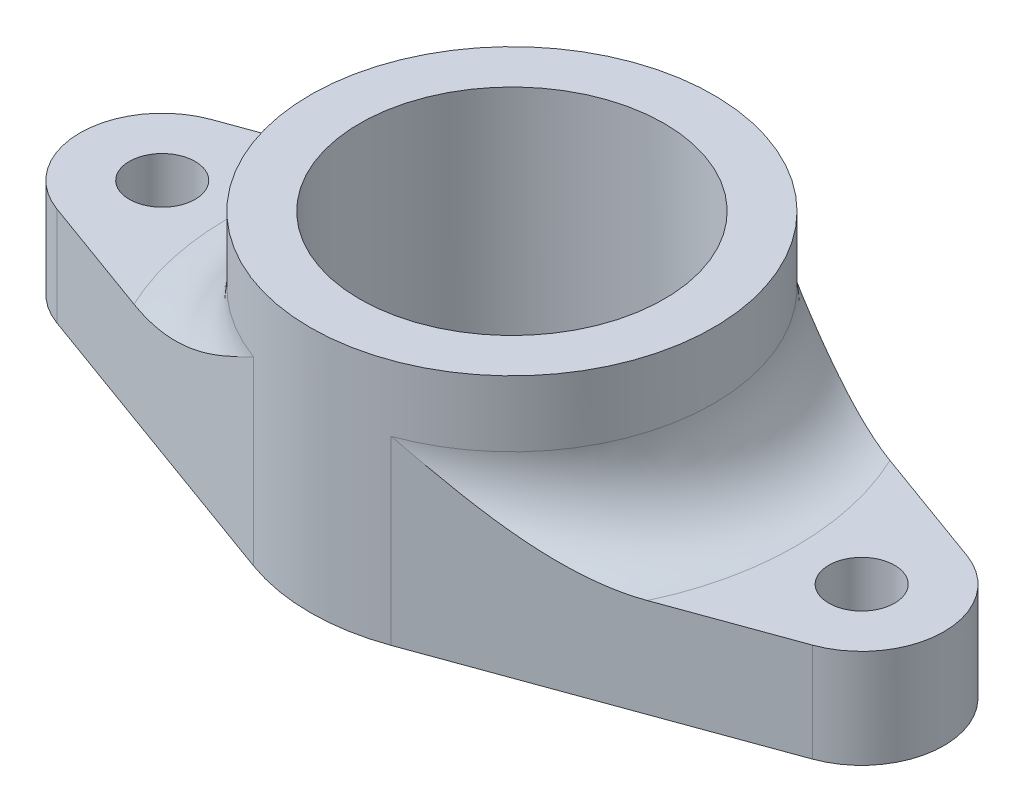
ISO-10303-21;
HEADER;
FILE_DESCRIPTION(('STEP AP214'),'2;1');
FILE_NAME('part.step','',(''),(''),'','','');
FILE_SCHEMA(('AUTOMOTIVE_DESIGN { 1 0 10303 214 1 1 1 1 }'));
ENDSEC;
DATA;
#1=APPLICATION_CONTEXT('core data for automotive mechanical design processes');
#2=APPLICATION_PROTOCOL_DEFINITION('international standard','automotive_design',2000,#1);
#3=PRODUCT_CONTEXT('',#1,'mechanical');
#4=PRODUCT('Part','Part','',(#3));
#5=PRODUCT_RELATED_PRODUCT_CATEGORY('part','',(#4));
#6=PRODUCT_DEFINITION_FORMATION('','',#4);
#7=PRODUCT_DEFINITION_CONTEXT('part definition',#1,'design');
#8=PRODUCT_DEFINITION('design','',#6,#7);
#9=PRODUCT_DEFINITION_SHAPE('','',#8);
#10=(LENGTH_UNIT() NAMED_UNIT(*) SI_UNIT(.MILLI.,.METRE.));
#11=(NAMED_UNIT(*) PLANE_ANGLE_UNIT() SI_UNIT($,.RADIAN.));
#12=(NAMED_UNIT(*) SI_UNIT($,.STERADIAN.) SOLID_ANGLE_UNIT());
#13=UNCERTAINTY_MEASURE_WITH_UNIT(LENGTH_MEASURE(1.E-05),#10,'distance_accuracy_value','');
#14=(GEOMETRIC_REPRESENTATION_CONTEXT(3) GLOBAL_UNCERTAINTY_ASSIGNED_CONTEXT((#13)) GLOBAL_UNIT_ASSIGNED_CONTEXT((#10,
#11,#12)) REPRESENTATION_CONTEXT('',''));
#15=CARTESIAN_POINT('',(0.,0.,0.));
#16=DIRECTION('',(0.,0.,1.));
#17=DIRECTION('',(1.,0.,0.));
#18=AXIS2_PLACEMENT_3D('',#15,#16,#17);
#19=CARTESIAN_POINT('',(45.9117647058824,30.,-9.39999263785326));
#20=DIRECTION('',(-0.341176470588235,0.,0.939999263785326));
#21=DIRECTION('',(0.939999263785326,0.,0.341176470588235));
#22=AXIS2_PLACEMENT_3D('',#19,#20,#21);
#23=PLANE('',#22);
#24=DIRECTION('',(0.,-1.,0.));
#25=VECTOR('',#24,1.);
#26=CARTESIAN_POINT('',(45.9117647058824,30.,-9.39999263785326));
#27=LINE('',#26,#25);
#28=CARTESIAN_POINT('',(45.9117647058824,12.,-9.39999263785326));
#29=VERTEX_POINT('',#28);
#30=CARTESIAN_POINT('',(45.9117647058824,0.324419722828727,-9.39999263785326));
#31=VERTEX_POINT('',#30);
#32=EDGE_CURVE('E189',#29,#31,#27,.T.);
#33=ORIENTED_EDGE('',*,*,#32,.T.);
#34=CARTESIAN_POINT('',(58.0344935479737,30.,-5.));
#35=DIRECTION('',(-0.341176470588235,0.,0.939999263785326));
#36=DIRECTION('',(0.939999263785326,0.,0.341176470588235));
#37=AXIS2_PLACEMENT_3D('',#34,#35,#36);
#38=ELLIPSE('',#37,87.9310344827587,30.);
#39=CARTESIAN_POINT('',(8.35882352941175,6.02251576117184,-23.0299819627405));
#40=VERTEX_POINT('',#39);
#41=EDGE_CURVE('E236',#31,#40,#38,.F.);
#42=ORIENTED_EDGE('',*,*,#41,.T.);
#43=DIRECTION('',(0.,-1.,0.));
#44=VECTOR('',#43,1.);
#45=CARTESIAN_POINT('',(8.35882352941175,30.,-23.0299819627405));
#46=LINE('',#45,#44);
#47=CARTESIAN_POINT('',(8.35882352941175,22.,-23.0299819627405));
#48=VERTEX_POINT('',#47);
#49=EDGE_CURVE('E186',#48,#40,#46,.T.);
#50=ORIENTED_EDGE('',*,*,#49,.F.);
#51=CARTESIAN_POINT('',(31.1913263136228,12.,-14.7428342864289));
#52=CARTESIAN_POINT('',(30.8777110643382,12.0000073378621,-14.8566621882112));
#53=CARTESIAN_POINT('',(30.5641739480095,12.0082756531448,-14.9704617313264));
#54=CARTESIAN_POINT('',(29.937897891219,12.0403376641737,-15.1977711164521));
#55=CARTESIAN_POINT('',(29.6251587227964,12.0641262695672,-15.3112810412019));
#56=CARTESIAN_POINT('',(28.6901381602218,12.1571533080674,-15.6506504723885));
#57=CARTESIAN_POINT('',(28.0696967786193,12.2480616970895,-15.8758421389539));
#58=CARTESIAN_POINT('',(26.8474714513449,12.4783617337878,-16.3194536815245));
#59=CARTESIAN_POINT('',(26.2455481434423,12.6169420095863,-16.5379241396055));
#60=CARTESIAN_POINT('',(25.0514761984913,12.9364455773889,-16.9713173001132));
#61=CARTESIAN_POINT('',(24.4593329446225,13.1173914080878,-17.1862380486934));
#62=CARTESIAN_POINT('',(23.1795364669182,13.5518396718945,-17.6507452692375));
#63=CARTESIAN_POINT('',(22.4940590513,13.8125506148255,-17.899542022957));
#64=CARTESIAN_POINT('',(21.1384689794888,14.3761332448321,-18.3915588298666));
#65=CARTESIAN_POINT('',(20.4683623794366,14.6790212283798,-18.6347766849562));
#66=CARTESIAN_POINT('',(19.1420369616807,15.3195610469771,-19.1161717693089));
#67=CARTESIAN_POINT('',(18.485837748894,15.6572584712313,-19.3543418828894));
#68=CARTESIAN_POINT('',(17.186750500828,16.36010858115,-19.8258507652438));
#69=CARTESIAN_POINT('',(16.5438609881086,16.7252581984226,-20.0591900702604));
#70=CARTESIAN_POINT('',(14.6213531496957,17.8586796798996,-20.7569719348404));
#71=CARTESIAN_POINT('',(13.3587757100659,18.6594284513756,-21.2152294370458));
#72=CARTESIAN_POINT('',(10.8586633458536,20.3011376891606,-22.1226551610417));
#73=CARTESIAN_POINT('',(9.62111534727721,21.1420763477815,-22.5718281280902));
#74=CARTESIAN_POINT('',(8.37535543125895,21.9887639871963,-23.0239816432279));
#75=CARTESIAN_POINT('',(8.36708948093573,21.9943819936823,-23.0269818027663));
#76=CARTESIAN_POINT('',(8.35882352941175,22.,-23.0299819627405));
#77=B_SPLINE_CURVE_WITH_KNOTS('',3,(#51,#52,#53,#54,#55,#56,#57,#58,#59,#60,#61,#62,#63,#64,#65,
#66,#67,#68,#69,#70,#71,#72,#73,#74,#75,#76),.UNSPECIFIED.,.F.,.F.,(4,2,2,2,2,2,2,2,2,2,2,2,4),
(0.,1.00065964365418,2.00099125531526,3.997339680309,5.96126632802583,7.92624017854259,
10.2479281160948,12.5705156153719,14.896184568491,17.2215939618462,21.9107675400901,
26.5974249619814,26.6287299136658),.UNSPECIFIED.);
#78=CARTESIAN_POINT('',(31.1913263136228,12.,-14.7428342864289));
#79=VERTEX_POINT('',#78);
#80=EDGE_CURVE('E264',#48,#79,#77,.F.);
#81=ORIENTED_EDGE('',*,*,#80,.T.);
#82=DIRECTION('',(-0.939999263785326,0.,-0.341176470588235));
#83=VECTOR('',#82,1.);
#84=CARTESIAN_POINT('',(45.9117647058824,12.,-9.39999263785326));
#85=LINE('',#84,#83);
#86=EDGE_CURVE('E295',#29,#79,#85,.T.);
#87=ORIENTED_EDGE('',*,*,#86,.F.);
#88=EDGE_LOOP('',(#33,#42,#50,#81,#87));
#89=FACE_BOUND('',#88,.T.);
#90=ADVANCED_FACE('F40',(#89),#23,.F.);
#91=CARTESIAN_POINT('',(-45.9117647058824,30.,-9.39999263785326));
#92=DIRECTION('',(0.341176470588235,0.,0.939999263785326));
#93=DIRECTION('',(0.939999263785326,0.,-0.341176470588235));
#94=AXIS2_PLACEMENT_3D('',#91,#92,#93);
#95=PLANE('',#94);
#96=DIRECTION('',(0.,-1.,0.));
#97=VECTOR('',#96,1.);
#98=CARTESIAN_POINT('',(-8.35882352941175,30.,-23.0299819627405));
#99=LINE('',#98,#97);
#100=CARTESIAN_POINT('',(-8.35882352941175,22.,-23.0299819627405));
#101=VERTEX_POINT('',#100);
#102=CARTESIAN_POINT('',(-8.35882352941175,6.02251576117184,-23.0299819627405));
#103=VERTEX_POINT('',#102);
#104=EDGE_CURVE('E183',#101,#103,#99,.T.);
#105=ORIENTED_EDGE('',*,*,#104,.T.);
#106=CARTESIAN_POINT('',(-58.0344935479737,30.,-5.));
#107=DIRECTION('',(0.341176470588235,0.,0.939999263785326));
#108=DIRECTION('',(0.939999263785326,0.,-0.341176470588235));
#109=AXIS2_PLACEMENT_3D('',#106,#107,#108);
#110=ELLIPSE('',#109,87.9310344827587,30.);
#111=CARTESIAN_POINT('',(-45.9117647058824,0.324419722828727,-9.39999263785326));
#112=VERTEX_POINT('',#111);
#113=EDGE_CURVE('E472',#103,#112,#110,.F.);
#114=ORIENTED_EDGE('',*,*,#113,.T.);
#115=DIRECTION('',(0.,-1.,0.));
#116=VECTOR('',#115,1.);
#117=CARTESIAN_POINT('',(-45.9117647058824,30.,-9.39999263785326));
#118=LINE('',#117,#116);
#119=CARTESIAN_POINT('',(-45.9117647058824,12.,-9.39999263785326));
#120=VERTEX_POINT('',#119);
#121=EDGE_CURVE('E155',#120,#112,#118,.T.);
#122=ORIENTED_EDGE('',*,*,#121,.F.);
#123=DIRECTION('',(-0.939999263785326,0.,0.341176470588235));
#124=VECTOR('',#123,1.);
#125=CARTESIAN_POINT('',(-45.9117647058824,12.,-9.39999263785326));
#126=LINE('',#125,#124);
#127=CARTESIAN_POINT('',(-31.1913263136228,12.,-14.7428342864289));
#128=VERTEX_POINT('',#127);
#129=EDGE_CURVE('E336',#128,#120,#126,.T.);
#130=ORIENTED_EDGE('',*,*,#129,.F.);
#131=CARTESIAN_POINT('',(-31.1913263136228,12.,-14.7428342864289));
#132=CARTESIAN_POINT('',(-30.8777110643382,12.0000073378621,-14.8566621882112));
#133=CARTESIAN_POINT('',(-30.5641739480094,12.0082756531448,-14.9704617313265));
#134=CARTESIAN_POINT('',(-29.9378978912189,12.0403376641737,-15.1977711164522));
#135=CARTESIAN_POINT('',(-29.6251587227962,12.0641262695672,-15.311281041202));
#136=CARTESIAN_POINT('',(-28.6901381602215,12.1571533080674,-15.6506504723886));
#137=CARTESIAN_POINT('',(-28.0696967786189,12.2480616970896,-15.875842138954));
#138=CARTESIAN_POINT('',(-26.8474714513445,12.4783617337879,-16.3194536815246));
#139=CARTESIAN_POINT('',(-26.245548143442,12.6169420095864,-16.5379241396056));
#140=CARTESIAN_POINT('',(-25.0514761984912,12.9364455773889,-16.9713173001132));
#141=CARTESIAN_POINT('',(-24.4593329446225,13.1173914080878,-17.1862380486934));
#142=CARTESIAN_POINT('',(-23.1795364669183,13.5518396718945,-17.6507452692374));
#143=CARTESIAN_POINT('',(-22.4940590513,13.8125506148254,-17.899542022957));
#144=CARTESIAN_POINT('',(-21.1384689794889,14.3761332448321,-18.3915588298665));
#145=CARTESIAN_POINT('',(-20.4683623794368,14.6790212283798,-18.6347766849562));
#146=CARTESIAN_POINT('',(-19.142036961681,15.319561046977,-19.1161717693088));
#147=CARTESIAN_POINT('',(-18.4858377488942,15.6572584712312,-19.3543418828893));
#148=CARTESIAN_POINT('',(-17.1867505008284,16.3601085811498,-19.8258507652436));
#149=CARTESIAN_POINT('',(-16.5438609881091,16.7252581984224,-20.0591900702602));
#150=CARTESIAN_POINT('',(-14.6213531496961,17.8586796798992,-20.7569719348402));
#151=CARTESIAN_POINT('',(-13.358775710066,18.6594284513746,-21.2152294370458));
#152=CARTESIAN_POINT('',(-10.8586633458544,20.3011376891609,-22.1226551610414));
#153=CARTESIAN_POINT('',(-9.62111534727907,21.1420763477837,-22.5718281280895));
#154=CARTESIAN_POINT('',(-8.37535543125921,21.9887639871962,-23.0239816432278));
#155=CARTESIAN_POINT('',(-8.36708948093586,21.9943819936822,-23.0269818027662));
#156=CARTESIAN_POINT('',(-8.35882352941175,22.,-23.0299819627405));
#157=B_SPLINE_CURVE_WITH_KNOTS('',3,(#131,#132,#133,#134,#135,#136,#137,#138,#139,#140,#141,
#142,#143,#144,#145,#146,#147,#148,#149,#150,#151,#152,#153,#154,#155,#156),.UNSPECIFIED.,.F.,
.F.,(4,2,2,2,2,2,2,2,2,2,2,2,4),(0.,1.00065964365432,2.00099125531554,3.9973396803095,
5.96126632802606,7.92624017854259,10.2479281160948,12.5705156153717,14.8961845684906,
17.2215939618456,21.9107675400895,26.5974249619809,26.6287299136657),.UNSPECIFIED.);
#158=EDGE_CURVE('E53',#128,#101,#157,.T.);
#159=ORIENTED_EDGE('',*,*,#158,.T.);
#160=EDGE_LOOP('',(#105,#114,#122,#130,#159));
#161=FACE_BOUND('',#160,.T.);
#162=ADVANCED_FACE('F281',(#161),#95,.F.);
#163=CARTESIAN_POINT('',(-42.5,30.,0.));
#164=DIRECTION('',(0.,1.,0.));
#165=DIRECTION('',(0.,0.,1.));
#166=AXIS2_PLACEMENT_3D('',#163,#164,#165);
#167=PLANE('',#166);
#168=CARTESIAN_POINT('',(0.,30.,0.));
#169=DIRECTION('',(0.,1.,0.));
#170=DIRECTION('',(0.,0.,1.));
#171=AXIS2_PLACEMENT_3D('',#168,#169,#170);
#172=CIRCLE('',#171,18.5);
#173=CARTESIAN_POINT('',(0.,30.,18.5));
#174=VERTEX_POINT('',#173);
#175=EDGE_CURVE('E304',#174,#174,#172,.T.);
#176=ORIENTED_EDGE('',*,*,#175,.F.);
#177=EDGE_LOOP('',(#176));
#178=FACE_BOUND('',#177,.T.);
#179=CARTESIAN_POINT('',(0.,30.,0.));
#180=DIRECTION('',(0.,1.,0.));
#181=DIRECTION('',(0.,0.,1.));
#182=AXIS2_PLACEMENT_3D('',#179,#180,#181);
#183=CIRCLE('',#182,24.5);
#184=CARTESIAN_POINT('',(0.,30.,24.5));
#185=VERTEX_POINT('',#184);
#186=EDGE_CURVE('E172',#185,#185,#183,.T.);
#187=ORIENTED_EDGE('',*,*,#186,.T.);
#188=EDGE_LOOP('',(#187));
#189=FACE_BOUND('',#188,.T.);
#190=ADVANCED_FACE('F276',(#178,#189),#167,.T.);
#191=CARTESIAN_POINT('',(-42.5,30.,0.));
#192=DIRECTION('',(0.,-1.,0.));
#193=DIRECTION('',(0.,0.,-1.));
#194=AXIS2_PLACEMENT_3D('',#191,#192,#193);
#195=CYLINDRICAL_SURFACE('',#194,10.);
#196=ORIENTED_EDGE('',*,*,#121,.T.);
#197=CARTESIAN_POINT('',(-45.9117647058824,0.32441972282872,-9.39999263785326));
#198=CARTESIAN_POINT('',(-46.1799745548609,0.310008422247082,-9.30267592760921));
#199=CARTESIAN_POINT('',(-46.443930835537,0.294344467671924,-9.19385172958615));
#200=CARTESIAN_POINT('',(-46.96147069573,0.261476668663017,-8.95412956732473));
#201=CARTESIAN_POINT('',(-47.2150559896641,0.244273080255952,-8.8232352699487));
#202=CARTESIAN_POINT('',(-47.702980206477,0.209787703902949,-8.54433860607087));
#203=CARTESIAN_POINT('',(-47.9376625254509,0.192522308229374,-8.3969345380273));
#204=CARTESIAN_POINT('',(-48.3940180377936,0.15843267399223,-8.08314481895081));
#205=CARTESIAN_POINT('',(-48.6156906936765,0.1416084536714,-7.91675838450852));
#206=CARTESIAN_POINT('',(-49.0596190629436,0.108298722667632,-7.5537587292341));
#207=CARTESIAN_POINT('',(-49.2808199466869,0.0919201959336041,-7.35584279675397));
#208=CARTESIAN_POINT('',(-49.7048643168465,0.0621370428687547,-6.94103223534523));
#209=CARTESIAN_POINT('',(-49.9077068377589,0.0487325728959306,-6.72413660941413));
#210=CARTESIAN_POINT('',(-50.299529128267,0.0258140969930805,-6.26586180556841));
#211=CARTESIAN_POINT('',(-50.4878689038377,0.0164363049137206,-6.023925780992));
#212=CARTESIAN_POINT('',(-50.7531553271323,0.006755088416576,-5.64879873723965));
#213=CARTESIAN_POINT('',(-50.8387335989853,0.00425884988985906,-5.52168458966719));
#214=CARTESIAN_POINT('',(-51.0039723033205,0.000880845209396899,-5.26364145492279));
#215=CARTESIAN_POINT('',(-51.0836325890958,-8.80933353014231E-07,-5.13271237329048));
#216=CARTESIAN_POINT('',(-51.1602540378444,0.,-4.99999999999999));
#217=B_SPLINE_CURVE_WITH_KNOTS('',3,(#197,#198,#199,#200,#201,#202,#203,#204,#205,#206,#207,
#208,#209,#210,#211,#212,#213,#214,#215,#216),.UNSPECIFIED.,.F.,.F.,(4,2,2,2,2,2,2,2,2,4),(0.,
0.856773504201307,1.71340479878935,2.54546885001022,3.37756725325678,4.26817012810295,
5.15881981439677,6.07759335362183,6.53721913230035,6.99685630131329),.UNSPECIFIED.);
#218=CARTESIAN_POINT('',(-51.1602540378444,0.,-5.));
#219=VERTEX_POINT('',#218);
#220=EDGE_CURVE('E136',#112,#219,#217,.T.);
#221=ORIENTED_EDGE('',*,*,#220,.T.);
#222=CARTESIAN_POINT('',(-42.5,0.,0.));
#223=DIRECTION('',(0.,1.,0.));
#224=DIRECTION('',(0.,0.,1.));
#225=AXIS2_PLACEMENT_3D('',#222,#223,#224);
#226=CIRCLE('',#225,10.);
#227=CARTESIAN_POINT('',(-45.9117647058824,0.,9.39999263785326));
#228=VERTEX_POINT('',#227);
#229=EDGE_CURVE('E151',#219,#228,#226,.T.);
#230=ORIENTED_EDGE('',*,*,#229,.T.);
#231=DIRECTION('',(0.,-1.,0.));
#232=VECTOR('',#231,1.);
#233=CARTESIAN_POINT('',(-45.9117647058824,30.,9.39999263785326));
#234=LINE('',#233,#232);
#235=CARTESIAN_POINT('',(-45.9117647058824,12.,9.39999263785326));
#236=VERTEX_POINT('',#235);
#237=EDGE_CURVE('E198',#236,#228,#234,.T.);
#238=ORIENTED_EDGE('',*,*,#237,.F.);
#239=CARTESIAN_POINT('',(-42.5,12.,0.));
#240=DIRECTION('',(0.,1.,0.));
#241=DIRECTION('',(0.,0.,1.));
#242=AXIS2_PLACEMENT_3D('',#239,#240,#241);
#243=CIRCLE('',#242,10.);
#244=EDGE_CURVE('E337',#120,#236,#243,.T.);
#245=ORIENTED_EDGE('',*,*,#244,.F.);
#246=EDGE_LOOP('',(#196,#221,#230,#238,#245));
#247=FACE_BOUND('',#246,.T.);
#248=ADVANCED_FACE('F149',(#247),#195,.T.);
#249=CARTESIAN_POINT('',(-45.9117647058824,30.,9.39999263785326));
#250=DIRECTION('',(0.341176470588235,0.,-0.939999263785326));
#251=DIRECTION('',(-0.939999263785326,0.,-0.341176470588235));
#252=AXIS2_PLACEMENT_3D('',#249,#250,#251);
#253=PLANE('',#252);
#254=DIRECTION('',(0.939999263785326,0.,0.341176470588235));
#255=VECTOR('',#254,1.);
#256=CARTESIAN_POINT('',(-45.9117647058824,12.,9.39999263785326));
#257=LINE('',#256,#255);
#258=CARTESIAN_POINT('',(-31.1913263136228,12.,14.7428342864289));
#259=VERTEX_POINT('',#258);
#260=EDGE_CURVE('E325',#236,#259,#257,.T.);
#261=ORIENTED_EDGE('',*,*,#260,.F.);
#262=ORIENTED_EDGE('',*,*,#237,.T.);
#263=DIRECTION('',(0.939999263785326,0.,0.341176470588235));
#264=VECTOR('',#263,1.);
#265=CARTESIAN_POINT('',(-45.9117647058824,0.,9.39999263785326));
#266=LINE('',#265,#264);
#267=CARTESIAN_POINT('',(-8.35882352941177,0.,23.0299819627405));
#268=VERTEX_POINT('',#267);
#269=EDGE_CURVE('E163',#228,#268,#266,.T.);
#270=ORIENTED_EDGE('',*,*,#269,.T.);
#271=DIRECTION('',(0.,-1.,0.));
#272=VECTOR('',#271,1.);
#273=CARTESIAN_POINT('',(-8.35882352941177,30.,23.0299819627405));
#274=LINE('',#273,#272);
#275=CARTESIAN_POINT('',(-8.35882352941177,22.,23.0299819627405));
#276=VERTEX_POINT('',#275);
#277=EDGE_CURVE('E196',#276,#268,#274,.T.);
#278=ORIENTED_EDGE('',*,*,#277,.F.);
#279=CARTESIAN_POINT('',(-31.1913263136228,12.,14.7428342864289));
#280=CARTESIAN_POINT('',(-30.8777110643382,12.0000073378621,14.8566621882112));
#281=CARTESIAN_POINT('',(-30.5641739480094,12.0082756531448,14.9704617313265));
#282=CARTESIAN_POINT('',(-29.9378978912189,12.0403376641737,15.1977711164522));
#283=CARTESIAN_POINT('',(-29.6251587227962,12.0641262695672,15.311281041202));
#284=CARTESIAN_POINT('',(-28.6901381602215,12.1571533080674,15.6506504723886));
#285=CARTESIAN_POINT('',(-28.0696967786189,12.2480616970896,15.875842138954));
#286=CARTESIAN_POINT('',(-26.8474714513445,12.4783617337879,16.3194536815246));
#287=CARTESIAN_POINT('',(-26.245548143442,12.6169420095864,16.5379241396056));
#288=CARTESIAN_POINT('',(-25.0514761984912,12.9364455773889,16.9713173001132));
#289=CARTESIAN_POINT('',(-24.4593329446225,13.1173914080878,17.1862380486934));
#290=CARTESIAN_POINT('',(-23.1795364669183,13.5518396718945,17.6507452692374));
#291=CARTESIAN_POINT('',(-22.4940590513,13.8125506148254,17.899542022957));
#292=CARTESIAN_POINT('',(-21.1384689794889,14.3761332448321,18.3915588298665));
#293=CARTESIAN_POINT('',(-20.4683623794368,14.6790212283798,18.6347766849562));
#294=CARTESIAN_POINT('',(-19.142036961681,15.319561046977,19.1161717693088));
#295=CARTESIAN_POINT('',(-18.4858377488942,15.6572584712312,19.3543418828893));
#296=CARTESIAN_POINT('',(-17.1867505008284,16.3601085811498,19.8258507652436));
#297=CARTESIAN_POINT('',(-16.5438609881091,16.7252581984224,20.0591900702602));
#298=CARTESIAN_POINT('',(-14.6213531496961,17.8586796798992,20.7569719348402));
#299=CARTESIAN_POINT('',(-13.358775710066,18.6594284513746,21.2152294370458));
#300=CARTESIAN_POINT('',(-10.8586633458544,20.3011376891609,22.1226551610414));
#301=CARTESIAN_POINT('',(-9.62111534727907,21.1420763477837,22.5718281280895));
#302=CARTESIAN_POINT('',(-8.37535543125921,21.9887639871962,23.0239816432278));
#303=CARTESIAN_POINT('',(-8.36708948093586,21.9943819936822,23.0269818027662));
#304=CARTESIAN_POINT('',(-8.35882352941175,22.,23.0299819627405));
#305=B_SPLINE_CURVE_WITH_KNOTS('',3,(#279,#280,#281,#282,#283,#284,#285,#286,#287,#288,#289,
#290,#291,#292,#293,#294,#295,#296,#297,#298,#299,#300,#301,#302,#303,#304),.UNSPECIFIED.,.F.,
.F.,(4,2,2,2,2,2,2,2,2,2,2,2,4),(0.,1.00065964365432,2.00099125531554,3.9973396803095,
5.96126632802606,7.92624017854259,10.2479281160948,12.5705156153717,14.8961845684906,
17.2215939618456,21.9107675400895,26.5974249619809,26.6287299136657),.UNSPECIFIED.);
#306=EDGE_CURVE('E13',#276,#259,#305,.F.);
#307=ORIENTED_EDGE('',*,*,#306,.T.);
#308=EDGE_LOOP('',(#261,#262,#270,#278,#307));
#309=FACE_BOUND('',#308,.T.);
#310=ADVANCED_FACE('F253',(#309),#253,.F.);
#311=CARTESIAN_POINT('',(45.9117647058824,30.,9.39999263785326));
#312=DIRECTION('',(-0.341176470588235,0.,-0.939999263785326));
#313=DIRECTION('',(-0.939999263785326,0.,0.341176470588235));
#314=AXIS2_PLACEMENT_3D('',#311,#312,#313);
#315=PLANE('',#314);
#316=DIRECTION('',(0.939999263785326,0.,-0.341176470588235));
#317=VECTOR('',#316,1.);
#318=CARTESIAN_POINT('',(45.9117647058824,12.,9.39999263785326));
#319=LINE('',#318,#317);
#320=CARTESIAN_POINT('',(31.1913263136228,12.,14.7428342864289));
#321=VERTEX_POINT('',#320);
#322=CARTESIAN_POINT('',(45.9117647058824,12.,9.39999263785326));
#323=VERTEX_POINT('',#322);
#324=EDGE_CURVE('E305',#321,#323,#319,.T.);
#325=ORIENTED_EDGE('',*,*,#324,.F.);
#326=CARTESIAN_POINT('',(31.1913263136228,12.,14.7428342864289));
#327=CARTESIAN_POINT('',(30.8777110643382,12.0000073378621,14.8566621882112));
#328=CARTESIAN_POINT('',(30.5641739480094,12.0082756531448,14.9704617313265));
#329=CARTESIAN_POINT('',(29.9378978912189,12.0403376641737,15.1977711164522));
#330=CARTESIAN_POINT('',(29.6251587227962,12.0641262695672,15.311281041202));
#331=CARTESIAN_POINT('',(28.6901381602215,12.1571533080674,15.6506504723886));
#332=CARTESIAN_POINT('',(28.0696967786189,12.2480616970896,15.875842138954));
#333=CARTESIAN_POINT('',(26.8474714513445,12.4783617337879,16.3194536815246));
#334=CARTESIAN_POINT('',(26.245548143442,12.6169420095864,16.5379241396056));
#335=CARTESIAN_POINT('',(25.0514761984912,12.9364455773889,16.9713173001132));
#336=CARTESIAN_POINT('',(24.4593329446225,13.1173914080878,17.1862380486934));
#337=CARTESIAN_POINT('',(23.1795364669183,13.5518396718945,17.6507452692374));
#338=CARTESIAN_POINT('',(22.4940590513,13.8125506148254,17.899542022957));
#339=CARTESIAN_POINT('',(21.1384689794889,14.3761332448321,18.3915588298665));
#340=CARTESIAN_POINT('',(20.4683623794368,14.6790212283798,18.6347766849562));
#341=CARTESIAN_POINT('',(19.142036961681,15.319561046977,19.1161717693088));
#342=CARTESIAN_POINT('',(18.4858377488942,15.6572584712312,19.3543418828893));
#343=CARTESIAN_POINT('',(17.1867505008284,16.3601085811498,19.8258507652436));
#344=CARTESIAN_POINT('',(16.5438609881091,16.7252581984224,20.0591900702602));
#345=CARTESIAN_POINT('',(14.6213531496961,17.8586796798992,20.7569719348402));
#346=CARTESIAN_POINT('',(13.358775710066,18.6594284513746,21.2152294370458));
#347=CARTESIAN_POINT('',(10.8586633458544,20.3011376891609,22.1226551610414));
#348=CARTESIAN_POINT('',(9.62111534727907,21.1420763477837,22.5718281280895));
#349=CARTESIAN_POINT('',(8.37535543125921,21.9887639871962,23.0239816432278));
#350=CARTESIAN_POINT('',(8.36708948093586,21.9943819936822,23.0269818027662));
#351=CARTESIAN_POINT('',(8.35882352941175,22.,23.0299819627405));
#352=B_SPLINE_CURVE_WITH_KNOTS('',3,(#326,#327,#328,#329,#330,#331,#332,#333,#334,#335,#336,
#337,#338,#339,#340,#341,#342,#343,#344,#345,#346,#347,#348,#349,#350,#351),.UNSPECIFIED.,.F.,
.F.,(4,2,2,2,2,2,2,2,2,2,2,2,4),(0.,1.00065964365432,2.00099125531554,3.9973396803095,
5.96126632802606,7.92624017854259,10.2479281160948,12.5705156153717,14.8961845684906,
17.2215939618456,21.9107675400895,26.5974249619809,26.6287299136657),.UNSPECIFIED.);
#353=CARTESIAN_POINT('',(8.35882352941175,22.,23.0299819627405));
#354=VERTEX_POINT('',#353);
#355=EDGE_CURVE('E257',#321,#354,#352,.T.);
#356=ORIENTED_EDGE('',*,*,#355,.T.);
#357=DIRECTION('',(0.,-1.,0.));
#358=VECTOR('',#357,1.);
#359=CARTESIAN_POINT('',(8.35882352941175,30.,23.0299819627405));
#360=LINE('',#359,#358);
#361=CARTESIAN_POINT('',(8.35882352941175,0.,23.0299819627405));
#362=VERTEX_POINT('',#361);
#363=EDGE_CURVE('E194',#354,#362,#360,.T.);
#364=ORIENTED_EDGE('',*,*,#363,.T.);
#365=DIRECTION('',(0.939999263785326,0.,-0.341176470588235));
#366=VECTOR('',#365,1.);
#367=CARTESIAN_POINT('',(45.9117647058824,0.,9.39999263785326));
#368=LINE('',#367,#366);
#369=CARTESIAN_POINT('',(45.9117647058824,0.,9.39999263785326));
#370=VERTEX_POINT('',#369);
#371=EDGE_CURVE('E176',#362,#370,#368,.T.);
#372=ORIENTED_EDGE('',*,*,#371,.T.);
#373=DIRECTION('',(0.,-1.,0.));
#374=VECTOR('',#373,1.);
#375=CARTESIAN_POINT('',(45.9117647058824,30.,9.39999263785326));
#376=LINE('',#375,#374);
#377=EDGE_CURVE('E192',#323,#370,#376,.T.);
#378=ORIENTED_EDGE('',*,*,#377,.F.);
#379=EDGE_LOOP('',(#325,#356,#364,#372,#378));
#380=FACE_BOUND('',#379,.T.);
#381=ADVANCED_FACE('F248',(#380),#315,.F.);
#382=CARTESIAN_POINT('',(42.5,30.,0.));
#383=DIRECTION('',(0.,-1.,0.));
#384=DIRECTION('',(0.,0.,-1.));
#385=AXIS2_PLACEMENT_3D('',#382,#383,#384);
#386=CYLINDRICAL_SURFACE('',#385,10.);
#387=CARTESIAN_POINT('',(42.5,0.,0.));
#388=DIRECTION('',(0.,1.,0.));
#389=DIRECTION('',(0.,0.,1.));
#390=AXIS2_PLACEMENT_3D('',#387,#388,#389);
#391=CIRCLE('',#390,10.);
#392=CARTESIAN_POINT('',(51.1602540378444,0.,-5.));
#393=VERTEX_POINT('',#392);
#394=EDGE_CURVE('E179',#370,#393,#391,.T.);
#395=ORIENTED_EDGE('',*,*,#394,.T.);
#396=CARTESIAN_POINT('',(51.1602540378444,0.,-4.99999999999999));
#397=CARTESIAN_POINT('',(51.0185009377183,-1.70972735198724E-05,-5.24559389215952));
#398=CARTESIAN_POINT('',(50.8662547782858,0.00301563303243807,-5.48510184450343));
#399=CARTESIAN_POINT('',(50.5421003664084,0.0141539919996282,-5.9501892131168));
#400=CARTESIAN_POINT('',(50.3701982703441,0.0222580358265828,-6.17577295664799));
#401=CARTESIAN_POINT('',(50.0131216950254,0.0422252287899918,-6.60521013154695));
#402=CARTESIAN_POINT('',(49.8284643445126,0.0539748002937822,-6.80949935319714));
#403=CARTESIAN_POINT('',(49.4430309705153,0.080281970855079,-7.20208233741037));
#404=CARTESIAN_POINT('',(49.2422537390381,0.0948397804714169,-7.39037489903432));
#405=CARTESIAN_POINT('',(48.8081151225729,0.127059557129752,-7.76510015994079));
#406=CARTESIAN_POINT('',(48.5734356525454,0.144880553066956,-7.94999489572705));
#407=CARTESIAN_POINT('',(48.0885120086051,0.181323441634953,-8.29805042532026));
#408=CARTESIAN_POINT('',(47.8382661906213,0.19994541879868,-8.46120891767356));
#409=CARTESIAN_POINT('',(47.3159588023546,0.237321268405186,-8.76933956570288));
#410=CARTESIAN_POINT('',(47.0434562165595,0.256060444196128,-8.91356678615626));
#411=CARTESIAN_POINT('',(46.4862135093059,0.291829372136235,-9.17634018967838));
#412=CARTESIAN_POINT('',(46.2014726606999,0.308859022511305,-9.29488484425914));
#413=CARTESIAN_POINT('',(45.9117647058824,0.324419722828719,-9.39999263785326));
#414=B_SPLINE_CURVE_WITH_KNOTS('',3,(#396,#397,#398,#399,#400,#401,#402,#403,#404,#405,#406,
#407,#408,#409,#410,#411,#412,#413),.UNSPECIFIED.,.F.,.F.,(4,2,2,2,2,2,2,2,4),(0.,
0.850393903388267,1.70052218312473,2.52644987983434,3.35243952784818,4.24911140233893,
5.14587814195208,6.07121282470201,6.9966025632688),.UNSPECIFIED.);
#415=EDGE_CURVE('E157',#393,#31,#414,.T.);
#416=ORIENTED_EDGE('',*,*,#415,.T.);
#417=ORIENTED_EDGE('',*,*,#32,.F.);
#418=CARTESIAN_POINT('',(42.5,12.,0.));
#419=DIRECTION('',(0.,1.,0.));
#420=DIRECTION('',(0.,0.,1.));
#421=AXIS2_PLACEMENT_3D('',#418,#419,#420);
#422=CIRCLE('',#421,10.);
#423=EDGE_CURVE('E297',#323,#29,#422,.T.);
#424=ORIENTED_EDGE('',*,*,#423,.F.);
#425=ORIENTED_EDGE('',*,*,#377,.T.);
#426=EDGE_LOOP('',(#395,#416,#417,#424,#425));
#427=FACE_BOUND('',#426,.T.);
#428=ADVANCED_FACE('F242',(#427),#386,.T.);
#429=CARTESIAN_POINT('',(-42.5,30.,0.));
#430=DIRECTION('',(0.,-1.,0.));
#431=DIRECTION('',(0.,0.,-1.));
#432=AXIS2_PLACEMENT_3D('',#429,#430,#431);
#433=CYLINDRICAL_SURFACE('',#432,4.);
#434=CARTESIAN_POINT('',(-42.5,0.,0.));
#435=DIRECTION('',(0.,1.,0.));
#436=DIRECTION('',(0.,0.,1.));
#437=AXIS2_PLACEMENT_3D('',#434,#435,#436);
#438=CIRCLE('',#437,4.);
#439=CARTESIAN_POINT('',(-42.5,0.,4.));
#440=VERTEX_POINT('',#439);
#441=EDGE_CURVE('E164',#440,#440,#438,.T.);
#442=ORIENTED_EDGE('',*,*,#441,.F.);
#443=EDGE_LOOP('',(#442));
#444=FACE_BOUND('',#443,.T.);
#445=CARTESIAN_POINT('',(-42.5,12.,0.));
#446=DIRECTION('',(0.,1.,0.));
#447=DIRECTION('',(0.,0.,1.));
#448=AXIS2_PLACEMENT_3D('',#445,#446,#447);
#449=CIRCLE('',#448,4.);
#450=CARTESIAN_POINT('',(-42.5,12.,4.));
#451=VERTEX_POINT('',#450);
#452=EDGE_CURVE('E202',#451,#451,#449,.T.);
#453=ORIENTED_EDGE('',*,*,#452,.T.);
#454=EDGE_LOOP('',(#453));
#455=FACE_BOUND('',#454,.T.);
#456=ADVANCED_FACE('F247',(#444,#455),#433,.F.);
#457=CARTESIAN_POINT('',(42.5,30.,0.));
#458=DIRECTION('',(0.,-1.,0.));
#459=DIRECTION('',(0.,0.,-1.));
#460=AXIS2_PLACEMENT_3D('',#457,#458,#459);
#461=CYLINDRICAL_SURFACE('',#460,4.00000000000001);
#462=CARTESIAN_POINT('',(42.5,0.,0.));
#463=DIRECTION('',(0.,1.,0.));
#464=DIRECTION('',(0.,0.,1.));
#465=AXIS2_PLACEMENT_3D('',#462,#463,#464);
#466=CIRCLE('',#465,4.00000000000001);
#467=CARTESIAN_POINT('',(42.5,0.,4.00000000000001));
#468=VERTEX_POINT('',#467);
#469=EDGE_CURVE('E169',#468,#468,#466,.T.);
#470=ORIENTED_EDGE('',*,*,#469,.F.);
#471=EDGE_LOOP('',(#470));
#472=FACE_BOUND('',#471,.T.);
#473=CARTESIAN_POINT('',(42.5,12.,0.));
#474=DIRECTION('',(0.,1.,0.));
#475=DIRECTION('',(0.,0.,1.));
#476=AXIS2_PLACEMENT_3D('',#473,#474,#475);
#477=CIRCLE('',#476,4.00000000000001);
#478=CARTESIAN_POINT('',(42.5,12.,4.00000000000001));
#479=VERTEX_POINT('',#478);
#480=EDGE_CURVE('E156',#479,#479,#477,.T.);
#481=ORIENTED_EDGE('',*,*,#480,.T.);
#482=EDGE_LOOP('',(#481));
#483=FACE_BOUND('',#482,.T.);
#484=ADVANCED_FACE('F315',(#472,#483),#461,.F.);
#485=CARTESIAN_POINT('',(-42.5,0.,0.));
#486=DIRECTION('',(0.,1.,0.));
#487=DIRECTION('',(0.,0.,1.));
#488=AXIS2_PLACEMENT_3D('',#485,#486,#487);
#489=PLANE('',#488);
#490=ORIENTED_EDGE('',*,*,#441,.T.);
#491=EDGE_LOOP('',(#490));
#492=FACE_BOUND('',#491,.T.);
#493=ORIENTED_EDGE('',*,*,#469,.T.);
#494=EDGE_LOOP('',(#493));
#495=FACE_BOUND('',#494,.T.);
#496=ORIENTED_EDGE('',*,*,#229,.F.);
#497=DIRECTION('',(1.,0.,0.));
#498=VECTOR('',#497,1.);
#499=CARTESIAN_POINT('',(-52.5,0.,-5.));
#500=LINE('',#499,#498);
#501=CARTESIAN_POINT('',(-17.8115131305569,0.,-5.));
#502=VERTEX_POINT('',#501);
#503=EDGE_CURVE('E133',#219,#502,#500,.T.);
#504=ORIENTED_EDGE('',*,*,#503,.T.);
#505=CARTESIAN_POINT('',(0.,0.,0.));
#506=DIRECTION('',(0.,1.,0.));
#507=DIRECTION('',(0.,0.,1.));
#508=AXIS2_PLACEMENT_3D('',#505,#506,#507);
#509=CIRCLE('',#508,18.5);
#510=CARTESIAN_POINT('',(17.8115131305569,0.,-5.));
#511=VERTEX_POINT('',#510);
#512=EDGE_CURVE('E302',#502,#511,#509,.T.);
#513=ORIENTED_EDGE('',*,*,#512,.T.);
#514=EDGE_CURVE('E145',#511,#393,#500,.T.);
#515=ORIENTED_EDGE('',*,*,#514,.T.);
#516=ORIENTED_EDGE('',*,*,#394,.F.);
#517=ORIENTED_EDGE('',*,*,#371,.F.);
#518=CARTESIAN_POINT('',(0.,0.,0.));
#519=DIRECTION('',(0.,1.,0.));
#520=DIRECTION('',(0.,0.,1.));
#521=AXIS2_PLACEMENT_3D('',#518,#519,#520);
#522=CIRCLE('',#521,24.5);
#523=EDGE_CURVE('E166',#268,#362,#522,.T.);
#524=ORIENTED_EDGE('',*,*,#523,.F.);
#525=ORIENTED_EDGE('',*,*,#269,.F.);
#526=EDGE_LOOP('',(#496,#504,#513,#515,#516,#517,#524,#525));
#527=FACE_BOUND('',#526,.T.);
#528=ADVANCED_FACE('F160',(#492,#495,#527),#489,.F.);
#529=CARTESIAN_POINT('',(0.,30.,0.));
#530=DIRECTION('',(0.,-1.,0.));
#531=DIRECTION('',(0.,0.,-1.));
#532=AXIS2_PLACEMENT_3D('',#529,#530,#531);
#533=CYLINDRICAL_SURFACE('',#532,24.5);
#534=ORIENTED_EDGE('',*,*,#363,.F.);
#535=CARTESIAN_POINT('',(0.,22.,0.));
#536=DIRECTION('',(0.,1.,0.));
#537=DIRECTION('',(0.,0.,1.));
#538=AXIS2_PLACEMENT_3D('',#535,#536,#537);
#539=CIRCLE('',#538,24.5);
#540=EDGE_CURVE('E331',#354,#48,#539,.T.);
#541=ORIENTED_EDGE('',*,*,#540,.T.);
#542=ORIENTED_EDGE('',*,*,#49,.T.);
#543=CARTESIAN_POINT('',(23.9843699104229,0.,-4.99999999999999));
#544=CARTESIAN_POINT('',(23.9211559577664,-9.20971221270623E-06,-5.30327450071418));
#545=CARTESIAN_POINT('',(23.8521746353165,0.00459851924593906,-5.60533371947271));
#546=CARTESIAN_POINT('',(23.7028918697866,0.0227590821700796,-6.20634057840401));
#547=CARTESIAN_POINT('',(23.622591530425,0.036311044456881,-6.50528851890941));
#548=CARTESIAN_POINT('',(23.4509563886905,0.0720540360260369,-7.0991624573293));
#549=CARTESIAN_POINT('',(23.3596323855747,0.0942366569634952,-7.39409208148276));
#550=CARTESIAN_POINT('',(23.1661594769139,0.146886727321369,-7.97960921553937));
#551=CARTESIAN_POINT('',(23.0640103566838,0.177354341069633,-8.27019663919696));
#552=CARTESIAN_POINT('',(22.7434135295707,0.280085335277427,-9.1301263120883));
#553=CARTESIAN_POINT('',(22.5094314340404,0.363975960196521,-9.692410941227));
#554=CARTESIAN_POINT('',(22.002422213712,0.559512312186613,-10.7940451938524));
#555=CARTESIAN_POINT('',(21.7293866720134,0.671164026239784,-11.3333898406607));
#556=CARTESIAN_POINT('',(21.1480454075837,0.917991793231832,-12.3842370172212));
#557=CARTESIAN_POINT('',(20.8398792759125,1.05307578315101,-12.8958385885953));
#558=CARTESIAN_POINT('',(20.1900209583542,1.34315545302427,-13.8912345393214));
#559=CARTESIAN_POINT('',(19.8483302540789,1.49815025311767,-14.3750301460553));
#560=CARTESIAN_POINT('',(19.1330004368488,1.8244240104206,-15.3142921647478));
#561=CARTESIAN_POINT('',(18.7592941017593,1.99573731976124,-15.7696953203171));
#562=CARTESIAN_POINT('',(17.9826582090524,2.35030873629464,-16.6498811790316));
#563=CARTESIAN_POINT('',(17.5797268860979,2.53356756498932,-17.0746620293394));
#564=CARTESIAN_POINT('',(16.6968117128728,2.93020489586965,-17.941387675195));
#565=CARTESIAN_POINT('',(16.2133652314313,3.14457200324373,-18.3793565022276));
#566=CARTESIAN_POINT('',(15.2141494152261,3.57720225259248,-19.2146765768324));
#567=CARTESIAN_POINT('',(14.6983765785241,3.795465814835,-19.6120234114835));
#568=CARTESIAN_POINT('',(13.6361645400448,4.22968899950247,-20.3648921724352));
#569=CARTESIAN_POINT('',(13.0897230391136,4.44564844774548,-20.7204109567874));
#570=CARTESIAN_POINT('',(11.9676816779406,4.86861690637881,-21.3880973148273));
#571=CARTESIAN_POINT('',(11.3920849625457,5.07562687766462,-21.7002695505867));
#572=CARTESIAN_POINT('',(10.2750501071761,5.4526931481298,-22.2490194986968));
#573=CARTESIAN_POINT('',(9.73636023751085,5.62434812463729,-22.4900916537737));
#574=CARTESIAN_POINT('',(8.63815358369496,5.9493056767509,-22.9343207457605));
#575=CARTESIAN_POINT('',(8.07863800100063,6.10260930891983,-23.1374798658574));
#576=CARTESIAN_POINT('',(6.9414522714475,6.38501215413044,-23.5036703024647));
#577=CARTESIAN_POINT('',(6.36380711142221,6.51414310796457,-23.6667543303017));
#578=CARTESIAN_POINT('',(5.19249454388601,6.74290575352426,-23.9510143286565));
#579=CARTESIAN_POINT('',(4.59882758500783,6.84253827031398,-24.0721914713157));
#580=CARTESIAN_POINT('',(3.39353439887659,7.00820764870739,-24.2716000948445));
#581=CARTESIAN_POINT('',(2.78178937184178,7.07390674280769,-24.3494003945233));
#582=CARTESIAN_POINT('',(1.55122021475305,7.16654971499093,-24.4586422616614));
#583=CARTESIAN_POINT('',(0.932396307645254,7.19349481024478,-24.4900852850931));
#584=CARTESIAN_POINT('',(-0.306072092445418,7.20702908355288,-24.5059116740337));
#585=CARTESIAN_POINT('',(-0.925716205770406,7.19363291498554,-24.4903121270705));
#586=CARTESIAN_POINT('',(-2.15988682953869,7.12731317849849,-24.4124388580248));
#587=CARTESIAN_POINT('',(-2.77441356586249,7.07439136468848,-24.3501672072045));
#588=CARTESIAN_POINT('',(-3.90602863309321,6.94221968061383,-24.1923839954988));
#589=CARTESIAN_POINT('',(-4.42454079127225,6.86778681439102,-24.1028620668234));
#590=CARTESIAN_POINT('',(-5.45107787376855,6.69496660177325,-23.8916392432761));
#591=CARTESIAN_POINT('',(-5.95909892611648,6.59657057679501,-23.7699266887555));
#592=CARTESIAN_POINT('',(-6.96249755928798,6.37919436825237,-23.4956246616143));
#593=CARTESIAN_POINT('',(-7.4578675384416,6.26020212810997,-23.3430170947979));
#594=CARTESIAN_POINT('',(-8.43416159045841,6.00529592842398,-23.0082872038024));
#595=CARTESIAN_POINT('',(-8.91508261224087,5.86937842563907,-22.826158697108));
#596=CARTESIAN_POINT('',(-9.71774199589376,5.62752739837141,-22.4931740545215));
#597=CARTESIAN_POINT('',(-10.0435484066456,5.52499170075198,-22.3495702548669));
#598=CARTESIAN_POINT('',(-10.6871467454077,5.31471633197581,-22.049058986554));
#599=CARTESIAN_POINT('',(-11.004940226887,5.20697768150985,-21.8921541227102));
#600=CARTESIAN_POINT('',(-11.9462378606791,4.87759811016857,-21.4018254721715));
#601=CARTESIAN_POINT('',(-12.557545419663,4.64982860632407,-21.048834984473));
#602=CARTESIAN_POINT('',(-13.7464696351127,4.18645213161127,-20.2924131109141));
#603=CARTESIAN_POINT('',(-14.3240244269304,3.95083193995005,-19.8888931163006));
#604=CARTESIAN_POINT('',(-15.4424292497629,3.48025088798742,-19.0335712910229));
#605=CARTESIAN_POINT('',(-15.9832829629711,3.24528996381645,-18.5817743156991));
#606=CARTESIAN_POINT('',(-17.0312030359919,2.78135521254059,-17.6265640003156));
#607=CARTESIAN_POINT('',(-17.5378781137787,2.55246459035648,-17.1226803226939));
#608=CARTESIAN_POINT('',(-18.5084654720808,2.1107077105885,-16.0686003707994));
#609=CARTESIAN_POINT('',(-18.9723739674914,1.89784287168977,-15.5184000054446));
#610=CARTESIAN_POINT('',(-19.8520158679543,1.49634084497919,-14.3758596607202));
#611=CARTESIAN_POINT('',(-20.2679187740246,1.30761814193643,-13.7836806585447));
#612=CARTESIAN_POINT('',(-21.0490877986749,0.960791267228517,-12.5583953441876));
#613=CARTESIAN_POINT('',(-21.4143699232023,0.802677410948363,-11.9253020620921));
#614=CARTESIAN_POINT('',(-22.0044298366125,0.559201627668263,-10.7868526736258));
#615=CARTESIAN_POINT('',(-22.2414078621979,0.465548670068381,-10.2895545035648));
#616=CARTESIAN_POINT('',(-22.6824468626939,0.302007572706224,-9.2769290012363));
#617=CARTESIAN_POINT('',(-22.8865192537529,0.232111181572357,-8.76160799757106));
#618=CARTESIAN_POINT('',(-23.2612339066742,0.118157939608862,-7.71215568490649));
#619=CARTESIAN_POINT('',(-23.4316457469075,0.0742753362400593,-7.17792237865882));
#620=CARTESIAN_POINT('',(-23.6597464695958,0.0299603373832021,-6.36752382837802));
#621=CARTESIAN_POINT('',(-23.7312256955692,0.0187732632698756,-6.09573044433063));
#622=CARTESIAN_POINT('',(-23.8648401565793,0.00379118371186049,-5.54963410126714));
#623=CARTESIAN_POINT('',(-23.9269746960951,-3.27175453772849E-06,-5.27533095706102));
#624=CARTESIAN_POINT('',(-23.9843699104229,0.,-4.99999999999999));
#625=B_SPLINE_CURVE_WITH_KNOTS('',3,(#543,#544,#545,#546,#547,#548,#549,#550,#551,#552,#553,
#554,#555,#556,#557,#558,#559,#560,#561,#562,#563,#564,#565,#566,#567,#568,#569,#570,#571,#572,
#573,#574,#575,#576,#577,#578,#579,#580,#581,#582,#583,#584,#585,#586,#587,#588,#589,#590,#591,
#592,#593,#594,#595,#596,#597,#598,#599,#600,#601,#602,#603,#604,#605,#606,#607,#608,#609,#610,
#611,#612,#613,#614,#615,#616,#617,#618,#619,#620,#621,#622,#623,#624),.UNSPECIFIED.,.F.,.F.,(4,
2,2,2,2,2,2,2,2,2,2,2,2,2,2,2,2,2,2,2,2,2,2,2,2,2,2,2,2,2,2,2,2,2,2,2,2,2,2,2,4),(0.,
0.929267182089314,1.85844381384911,2.78671746090866,3.71500952106073,5.55670724574204,
7.39880249768406,9.23381781902421,11.0687520787323,12.9076382214904,14.7466355349242,
16.8045426719456,18.8626731302087,20.9209580880614,22.9790214984661,24.8212503217984,
26.6633730293316,28.503059639716,30.3426947896485,32.2003046107585,34.0578560874885,
35.9147329170087,37.7715273450375,39.3641496137275,40.9573495321825,42.5514852490777,
44.145955255225,45.2571632256213,46.3681540830562,48.5905188795415,50.8168368813859,
53.0429311870519,55.2912526482135,57.5397729089462,59.7800939844826,62.0197050615024,
63.6944224644586,65.3685575917309,67.0537834082483,67.8973275092574,68.740934363839),.UNSPECIFIED.);
#626=EDGE_CURVE('E144',#40,#103,#625,.T.);
#627=ORIENTED_EDGE('',*,*,#626,.T.);
#628=ORIENTED_EDGE('',*,*,#104,.F.);
#629=CARTESIAN_POINT('',(0.,22.,0.));
#630=DIRECTION('',(0.,1.,0.));
#631=DIRECTION('',(0.,0.,1.));
#632=AXIS2_PLACEMENT_3D('',#629,#630,#631);
#633=CIRCLE('',#632,24.5);
#634=EDGE_CURVE('E329',#101,#276,#633,.T.);
#635=ORIENTED_EDGE('',*,*,#634,.T.);
#636=ORIENTED_EDGE('',*,*,#277,.T.);
#637=ORIENTED_EDGE('',*,*,#523,.T.);
#638=EDGE_LOOP('',(#534,#541,#542,#627,#628,#635,#636,#637));
#639=FACE_BOUND('',#638,.T.);
#640=ORIENTED_EDGE('',*,*,#186,.F.);
#641=EDGE_LOOP('',(#640));
#642=FACE_BOUND('',#641,.T.);
#643=ADVANCED_FACE('F392',(#639,#642),#533,.T.);
#644=CARTESIAN_POINT('',(0.,30.,0.));
#645=DIRECTION('',(0.,-1.,0.));
#646=DIRECTION('',(0.,0.,-1.));
#647=AXIS2_PLACEMENT_3D('',#644,#645,#646);
#648=CYLINDRICAL_SURFACE('',#647,18.5);
#649=CARTESIAN_POINT('',(17.8115131305569,0.,-4.99999999999999));
#650=CARTESIAN_POINT('',(17.7446859408526,-3.12189635433287E-06,-5.23806554663736));
#651=CARTESIAN_POINT('',(17.6730917557426,0.00283450973996523,-5.4747528147124));
#652=CARTESIAN_POINT('',(17.5205253597887,0.0139638336628106,-5.94493695014211));
#653=CARTESIAN_POINT('',(17.4395538433175,0.0222551223293426,-6.17843405229264));
#654=CARTESIAN_POINT('',(17.1829504752525,0.0549487294954418,-6.87311110957425));
#655=CARTESIAN_POINT('',(16.9935049532844,0.0871716374634311,-7.32892107712597));
#656=CARTESIAN_POINT('',(16.5806651735425,0.169985438078174,-8.2201980344141));
#657=CARTESIAN_POINT('',(16.3574487239587,0.220481950242412,-8.6557568049176));
#658=CARTESIAN_POINT('',(15.8782377451457,0.337271001435166,-9.50630579452874));
#659=CARTESIAN_POINT('',(15.6222382090556,0.403565954645703,-9.92129285832535));
#660=CARTESIAN_POINT('',(15.0801860888756,0.548918063261126,-10.7272214580324));
#661=CARTESIAN_POINT('',(14.7942093871596,0.627943254152784,-11.1182199174686));
#662=CARTESIAN_POINT('',(14.1936828264652,0.795881066738292,-11.8753031925435));
#663=CARTESIAN_POINT('',(13.8791339105847,0.884793362105039,-12.2413888297956));
#664=CARTESIAN_POINT('',(13.2229569852393,1.06953722729058,-12.9474314975133));
#665=CARTESIAN_POINT('',(12.8812947943895,1.16537751714868,-13.2873544469945));
#666=CARTESIAN_POINT('',(12.1729326924432,1.36075400837143,-13.9392076773001));
#667=CARTESIAN_POINT('',(11.8062209262384,1.46029194939949,-14.2511245399057));
#668=CARTESIAN_POINT('',(11.0211755952132,1.66732808423148,-14.867791620335));
#669=CARTESIAN_POINT('',(10.6010342619808,1.77486117077785,-15.1702326290077));
#670=CARTESIAN_POINT('',(9.73645178490174,1.98636277319479,-15.7390970521159));
#671=CARTESIAN_POINT('',(9.29202102205427,2.09033278144225,-16.0055356870456));
#672=CARTESIAN_POINT('',(8.38100422636018,2.29075632931534,-16.5008356663798));
#673=CARTESIAN_POINT('',(7.914416833119,2.38720940644625,-16.7296946995791));
#674=CARTESIAN_POINT('',(6.9617415603129,2.56867657337574,-17.1480252864961));
#675=CARTESIAN_POINT('',(6.47565413661775,2.65369093038551,-17.3374977603495));
#676=CARTESIAN_POINT('',(5.48344054322836,2.80916669844672,-17.6765004117895));
#677=CARTESIAN_POINT('',(4.97719535422109,2.87951899479985,-17.8257333818023));
#678=CARTESIAN_POINT('',(3.95163576470758,3.00159510153469,-18.0807559321061));
#679=CARTESIAN_POINT('',(3.43232132494501,3.05331885595438,-18.1865453818885));
#680=CARTESIAN_POINT('',(2.38530577143346,3.13552708976239,-18.3532304138109));
#681=CARTESIAN_POINT('',(1.85761216314696,3.16602958878049,-18.4141640869506));
#682=CARTESIAN_POINT('',(0.79813791172162,3.20427408014162,-18.4904019117857));
#683=CARTESIAN_POINT('',(0.266357695783951,3.21201841995466,-18.5057107696148));
#684=CARTESIAN_POINT('',(-0.742821009428683,3.20474159658364,-18.4912597149455));
#685=CARTESIAN_POINT('',(-1.22030532747,3.19193354274429,-18.4658813144702));
#686=CARTESIAN_POINT('',(-2.17102094461352,3.14815466005756,-18.3783706947725));
#687=CARTESIAN_POINT('',(-2.64425254088724,3.11718511047751,-18.3162410642466));
#688=CARTESIAN_POINT('',(-3.58321286775461,3.03836684171527,-18.1559219454656));
#689=CARTESIAN_POINT('',(-4.04894003928096,2.9905146612113,-18.0577250624369));
#690=CARTESIAN_POINT('',(-4.96977841135172,2.87984804037895,-17.8262925151708));
#691=CARTESIAN_POINT('',(-5.42488923436713,2.81703306884518,-17.6930556069334));
#692=CARTESIAN_POINT('',(-6.32027734128621,2.67906173338181,-17.3932816853216));
#693=CARTESIAN_POINT('',(-6.76060020575931,2.60394850037644,-17.2268606220609));
#694=CARTESIAN_POINT('',(-7.62595762120523,2.44385977712839,-16.8616558306611));
#695=CARTESIAN_POINT('',(-8.05098559893541,2.35888011138596,-16.6628583863158));
#696=CARTESIAN_POINT('',(-8.88373223306171,2.18189616762696,-16.2341830002019));
#697=CARTESIAN_POINT('',(-9.2914444064165,2.08988929407714,-16.004293550049));
#698=CARTESIAN_POINT('',(-10.0876302585232,1.901809205289,-15.5147715556014));
#699=CARTESIAN_POINT('',(-10.4761027271296,1.80573573497159,-15.2551371437922));
#700=CARTESIAN_POINT('',(-11.2715205150868,1.60241595364622,-14.6788442513877));
#701=CARTESIAN_POINT('',(-11.6761772774426,1.49504793151966,-14.3590630896631));
#702=CARTESIAN_POINT('',(-12.457804700236,1.2829336934556,-13.6864519511361));
#703=CARTESIAN_POINT('',(-12.8347735486565,1.17818764940688,-13.3336198147671));
#704=CARTESIAN_POINT('',(-13.5583836238688,0.97535381093443,-12.5970811941018));
#705=CARTESIAN_POINT('',(-13.9050563228358,0.877259131287802,-12.2134075637328));
#706=CARTESIAN_POINT('',(-14.5661721201506,0.691447596045445,-11.4168516593016));
#707=CARTESIAN_POINT('',(-14.8806155587054,0.603730630902654,-11.0039696936359));
#708=CARTESIAN_POINT('',(-15.4700777772279,0.443686375889761,-10.158154129106));
#709=CARTESIAN_POINT('',(-15.7456471660608,0.371135173116448,-9.72564740752622));
#710=CARTESIAN_POINT('',(-16.2608100168792,0.243056478478891,-8.83739917972443));
#711=CARTESIAN_POINT('',(-16.5004101874897,0.187525810094187,-8.3816620275071));
#712=CARTESIAN_POINT('',(-16.9425516016978,0.0963232280593579,-7.44768766411072));
#713=CARTESIAN_POINT('',(-17.1449019922176,0.0607517731506673,-6.96934954239188));
#714=CARTESIAN_POINT('',(-17.4179774923363,0.0246252749118898,-6.2395283947291));
#715=CARTESIAN_POINT('',(-17.5039657934401,0.0154546000507923,-5.9940666325959));
#716=CARTESIAN_POINT('',(-17.6655677714325,0.00313977892000203,-5.4995798222777));
#717=CARTESIAN_POINT('',(-17.7411805435862,-3.84210678563795E-06,-5.25055446543924));
#718=CARTESIAN_POINT('',(-17.8115131305569,0.,-5.));
#719=B_SPLINE_CURVE_WITH_KNOTS('',3,(#649,#650,#651,#652,#653,#654,#655,#656,#657,#658,#659,
#660,#661,#662,#663,#664,#665,#666,#667,#668,#669,#670,#671,#672,#673,#674,#675,#676,#677,#678,
#679,#680,#681,#682,#683,#684,#685,#686,#687,#688,#689,#690,#691,#692,#693,#694,#695,#696,#697,
#698,#699,#700,#701,#702,#703,#704,#705,#706,#707,#708,#709,#710,#711,#712,#713,#714,#715,#716,
#717,#718),.UNSPECIFIED.,.F.,.F.,(4,2,2,2,2,2,2,2,2,2,2,2,2,2,2,2,2,2,2,2,2,2,2,2,2,2,2,2,2,2,2,
2,2,2,4),(0.,0.741661595328458,1.48326830715948,2.96510249696545,4.43938998123311,
5.91390289807456,7.38476955340015,8.85558767669364,10.3282904346205,11.8016950671021,
13.3860733032076,14.9697796120498,16.5535832848927,18.1373499532842,19.7325123475648,
21.3276795338329,22.9214905552528,24.5151371716828,25.9483671064706,27.3814960989086,
28.8149190861646,30.2483929700431,31.6769431995802,33.1061002141916,34.5357876716288,
35.9655649401293,37.5442227596345,39.1229838014529,40.7000848039598,42.277169157117,
43.8290034090797,45.3805478676176,46.9398330763942,47.72031805131,48.5008710404789),.UNSPECIFIED.);
#720=EDGE_CURVE('E139',#511,#502,#719,.T.);
#721=ORIENTED_EDGE('',*,*,#720,.F.);
#722=ORIENTED_EDGE('',*,*,#512,.F.);
#723=EDGE_LOOP('',(#721,#722));
#724=FACE_BOUND('',#723,.T.);
#725=ORIENTED_EDGE('',*,*,#175,.T.);
#726=EDGE_LOOP('',(#725));
#727=FACE_BOUND('',#726,.T.);
#728=ADVANCED_FACE('F211',(#724,#727),#648,.F.);
#729=CARTESIAN_POINT('',(-42.5,12.,0.));
#730=DIRECTION('',(0.,1.,0.));
#731=DIRECTION('',(0.,0.,1.));
#732=AXIS2_PLACEMENT_3D('',#729,#730,#731);
#733=PLANE('',#732);
#734=ORIENTED_EDGE('',*,*,#480,.F.);
#735=EDGE_LOOP('',(#734));
#736=FACE_BOUND('',#735,.T.);
#737=ORIENTED_EDGE('',*,*,#86,.T.);
#738=CARTESIAN_POINT('',(0.,12.,0.));
#739=DIRECTION('',(0.,1.,0.));
#740=DIRECTION('',(0.,0.,1.));
#741=AXIS2_PLACEMENT_3D('',#738,#739,#740);
#742=CIRCLE('',#741,34.5);
#743=EDGE_CURVE('E209',#79,#321,#742,.F.);
#744=ORIENTED_EDGE('',*,*,#743,.T.);
#745=ORIENTED_EDGE('',*,*,#324,.T.);
#746=ORIENTED_EDGE('',*,*,#423,.T.);
#747=EDGE_LOOP('',(#737,#744,#745,#746));
#748=FACE_BOUND('',#747,.T.);
#749=ADVANCED_FACE('F219',(#736,#748),#733,.T.);
#750=ORIENTED_EDGE('',*,*,#452,.F.);
#751=EDGE_LOOP('',(#750));
#752=FACE_BOUND('',#751,.T.);
#753=ORIENTED_EDGE('',*,*,#260,.T.);
#754=CARTESIAN_POINT('',(0.,12.,0.));
#755=DIRECTION('',(0.,1.,0.));
#756=DIRECTION('',(0.,0.,1.));
#757=AXIS2_PLACEMENT_3D('',#754,#755,#756);
#758=CIRCLE('',#757,34.5);
#759=EDGE_CURVE('E265',#259,#128,#758,.F.);
#760=ORIENTED_EDGE('',*,*,#759,.T.);
#761=ORIENTED_EDGE('',*,*,#129,.T.);
#762=ORIENTED_EDGE('',*,*,#244,.T.);
#763=EDGE_LOOP('',(#753,#760,#761,#762));
#764=FACE_BOUND('',#763,.T.);
#765=ADVANCED_FACE('F218',(#752,#764),#733,.T.);
#766=CARTESIAN_POINT('',(-52.5,30.,-5.));
#767=DIRECTION('',(1.,0.,0.));
#768=DIRECTION('',(0.,0.,-1.));
#769=AXIS2_PLACEMENT_3D('',#766,#767,#768);
#770=CYLINDRICAL_SURFACE('',#769,30.);
#771=ORIENTED_EDGE('',*,*,#113,.F.);
#772=ORIENTED_EDGE('',*,*,#626,.F.);
#773=ORIENTED_EDGE('',*,*,#41,.F.);
#774=ORIENTED_EDGE('',*,*,#415,.F.);
#775=ORIENTED_EDGE('',*,*,#514,.F.);
#776=ORIENTED_EDGE('',*,*,#720,.T.);
#777=ORIENTED_EDGE('',*,*,#503,.F.);
#778=ORIENTED_EDGE('',*,*,#220,.F.);
#779=EDGE_LOOP('',(#771,#772,#773,#774,#775,#776,#777,#778));
#780=FACE_BOUND('',#779,.T.);
#781=ADVANCED_FACE('F135',(#780),#770,.T.);
#782=CARTESIAN_POINT('',(0.,22.,0.));
#783=DIRECTION('',(0.,1.,0.));
#784=DIRECTION('',(0.,0.,1.));
#785=AXIS2_PLACEMENT_3D('',#782,#783,#784);
#786=TOROIDAL_SURFACE('',#785,34.5,10.);
#787=ORIENTED_EDGE('',*,*,#80,.F.);
#788=ORIENTED_EDGE('',*,*,#540,.F.);
#789=ORIENTED_EDGE('',*,*,#355,.F.);
#790=ORIENTED_EDGE('',*,*,#743,.F.);
#791=EDGE_LOOP('',(#787,#788,#789,#790));
#792=FACE_BOUND('',#791,.T.);
#793=ADVANCED_FACE('F217',(#792),#786,.F.);
#794=CARTESIAN_POINT('',(0.,22.,0.));
#795=DIRECTION('',(0.,1.,0.));
#796=DIRECTION('',(0.,0.,1.));
#797=AXIS2_PLACEMENT_3D('',#794,#795,#796);
#798=TOROIDAL_SURFACE('',#797,34.5,10.);
#799=ORIENTED_EDGE('',*,*,#306,.F.);
#800=ORIENTED_EDGE('',*,*,#634,.F.);
#801=ORIENTED_EDGE('',*,*,#158,.F.);
#802=ORIENTED_EDGE('',*,*,#759,.F.);
#803=EDGE_LOOP('',(#799,#800,#801,#802));
#804=FACE_BOUND('',#803,.T.);
#805=ADVANCED_FACE('F42',(#804),#798,.F.);
#806=CLOSED_SHELL('',(#90,#162,#190,#248,#310,#381,#428,#456,#484,#528,#643,#728,#749,#765,#781,
#793,#805));
#807=MANIFOLD_SOLID_BREP('B2',#806);
#808=ADVANCED_BREP_SHAPE_REPRESENTATION('',(#18,#807),#14);
#809=SHAPE_DEFINITION_REPRESENTATION(#9,#808);
ENDSEC;
END-ISO-10303-21;
